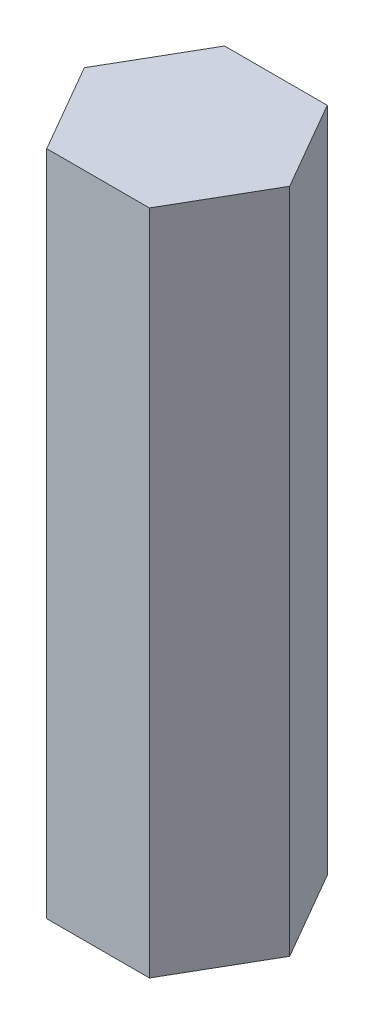
ISO-10303-21;
HEADER;
FILE_DESCRIPTION(('STEP AP214'),'2;1');
FILE_NAME('part.step','',(''),(''),'','','');
FILE_SCHEMA(('AUTOMOTIVE_DESIGN { 1 0 10303 214 1 1 1 1 }'));
ENDSEC;
DATA;
#1=APPLICATION_CONTEXT('core data for automotive mechanical design processes');
#2=APPLICATION_PROTOCOL_DEFINITION('international standard','automotive_design',2000,#1);
#3=PRODUCT_CONTEXT('',#1,'mechanical');
#4=PRODUCT('Part','Part','',(#3));
#5=PRODUCT_RELATED_PRODUCT_CATEGORY('part','',(#4));
#6=PRODUCT_DEFINITION_FORMATION('','',#4);
#7=PRODUCT_DEFINITION_CONTEXT('part definition',#1,'design');
#8=PRODUCT_DEFINITION('design','',#6,#7);
#9=PRODUCT_DEFINITION_SHAPE('','',#8);
#10=(LENGTH_UNIT() NAMED_UNIT(*) SI_UNIT(.MILLI.,.METRE.));
#11=(NAMED_UNIT(*) PLANE_ANGLE_UNIT() SI_UNIT($,.RADIAN.));
#12=(NAMED_UNIT(*) SI_UNIT($,.STERADIAN.) SOLID_ANGLE_UNIT());
#13=UNCERTAINTY_MEASURE_WITH_UNIT(LENGTH_MEASURE(1.E-05),#10,'distance_accuracy_value','');
#14=(GEOMETRIC_REPRESENTATION_CONTEXT(3) GLOBAL_UNCERTAINTY_ASSIGNED_CONTEXT((#13)) GLOBAL_UNIT_ASSIGNED_CONTEXT((#10,
#11,#12)) REPRESENTATION_CONTEXT('',''));
#15=CARTESIAN_POINT('',(0.,0.,0.));
#16=DIRECTION('',(0.,0.,1.));
#17=DIRECTION('',(1.,0.,0.));
#18=AXIS2_PLACEMENT_3D('',#15,#16,#17);
#19=CARTESIAN_POINT('',(1.15470053837927,15.,1.99999999999998));
#20=DIRECTION('',(-0.866025403784442,0.,-0.499999999999995));
#21=DIRECTION('',(-0.499999999999995,0.,0.866025403784442));
#22=AXIS2_PLACEMENT_3D('',#19,#20,#21);
#23=PLANE('',#22);
#24=DIRECTION('',(0.499999999999995,0.,-0.866025403784442));
#25=VECTOR('',#24,1.);
#26=CARTESIAN_POINT('',(1.15470053837927,0.,1.99999999999998));
#27=LINE('',#26,#25);
#28=CARTESIAN_POINT('',(1.15470053837927,0.,1.99999999999998));
#29=VERTEX_POINT('',#28);
#30=CARTESIAN_POINT('',(2.3094010767585,0.,0.));
#31=VERTEX_POINT('',#30);
#32=EDGE_CURVE('E128',#29,#31,#27,.T.);
#33=ORIENTED_EDGE('',*,*,#32,.T.);
#34=DIRECTION('',(0.,-1.,0.));
#35=VECTOR('',#34,1.);
#36=CARTESIAN_POINT('',(2.3094010767585,15.,0.));
#37=LINE('',#36,#35);
#38=CARTESIAN_POINT('',(2.3094010767585,15.,0.));
#39=VERTEX_POINT('',#38);
#40=EDGE_CURVE('E11',#39,#31,#37,.T.);
#41=ORIENTED_EDGE('',*,*,#40,.F.);
#42=DIRECTION('',(0.499999999999995,0.,-0.866025403784442));
#43=VECTOR('',#42,1.);
#44=CARTESIAN_POINT('',(1.15470053837927,15.,1.99999999999998));
#45=LINE('',#44,#43);
#46=CARTESIAN_POINT('',(1.15470053837927,15.,1.99999999999998));
#47=VERTEX_POINT('',#46);
#48=EDGE_CURVE('E144',#47,#39,#45,.T.);
#49=ORIENTED_EDGE('',*,*,#48,.F.);
#50=DIRECTION('',(0.,-1.,0.));
#51=VECTOR('',#50,1.);
#52=CARTESIAN_POINT('',(1.15470053837927,15.,1.99999999999998));
#53=LINE('',#52,#51);
#54=EDGE_CURVE('E124',#47,#29,#53,.T.);
#55=ORIENTED_EDGE('',*,*,#54,.T.);
#56=EDGE_LOOP('',(#33,#41,#49,#55));
#57=FACE_BOUND('',#56,.T.);
#58=ADVANCED_FACE('F39',(#57),#23,.F.);
#59=CARTESIAN_POINT('',(2.3094010767585,15.,0.));
#60=DIRECTION('',(-0.866025403784438,0.,0.500000000000001));
#61=DIRECTION('',(0.500000000000001,0.,0.866025403784438));
#62=AXIS2_PLACEMENT_3D('',#59,#60,#61);
#63=PLANE('',#62);
#64=DIRECTION('',(-0.500000000000001,0.,-0.866025403784438));
#65=VECTOR('',#64,1.);
#66=CARTESIAN_POINT('',(2.3094010767585,0.,0.));
#67=LINE('',#66,#65);
#68=CARTESIAN_POINT('',(1.15470053837925,0.,-2.));
#69=VERTEX_POINT('',#68);
#70=EDGE_CURVE('E132',#31,#69,#67,.T.);
#71=ORIENTED_EDGE('',*,*,#70,.T.);
#72=DIRECTION('',(0.,-1.,0.));
#73=VECTOR('',#72,1.);
#74=CARTESIAN_POINT('',(1.15470053837925,15.,-2.));
#75=LINE('',#74,#73);
#76=CARTESIAN_POINT('',(1.15470053837925,15.,-2.));
#77=VERTEX_POINT('',#76);
#78=EDGE_CURVE('E48',#77,#69,#75,.T.);
#79=ORIENTED_EDGE('',*,*,#78,.F.);
#80=DIRECTION('',(-0.500000000000001,0.,-0.866025403784438));
#81=VECTOR('',#80,1.);
#82=CARTESIAN_POINT('',(2.3094010767585,15.,0.));
#83=LINE('',#82,#81);
#84=EDGE_CURVE('E93',#39,#77,#83,.T.);
#85=ORIENTED_EDGE('',*,*,#84,.F.);
#86=ORIENTED_EDGE('',*,*,#40,.T.);
#87=EDGE_LOOP('',(#71,#79,#85,#86));
#88=FACE_BOUND('',#87,.T.);
#89=ADVANCED_FACE('F172',(#88),#63,.F.);
#90=CARTESIAN_POINT('',(1.15470053837925,15.,-2.));
#91=DIRECTION('',(0.,0.,1.));
#92=DIRECTION('',(1.,0.,0.));
#93=AXIS2_PLACEMENT_3D('',#90,#91,#92);
#94=PLANE('',#93);
#95=DIRECTION('',(-1.,0.,0.));
#96=VECTOR('',#95,1.);
#97=CARTESIAN_POINT('',(1.15470053837925,0.,-2.));
#98=LINE('',#97,#96);
#99=CARTESIAN_POINT('',(-1.15470053837926,0.,-1.99999999999999));
#100=VERTEX_POINT('',#99);
#101=EDGE_CURVE('E135',#69,#100,#98,.T.);
#102=ORIENTED_EDGE('',*,*,#101,.T.);
#103=DIRECTION('',(0.,-1.,0.));
#104=VECTOR('',#103,1.);
#105=CARTESIAN_POINT('',(-1.15470053837926,15.,-1.99999999999999));
#106=LINE('',#105,#104);
#107=CARTESIAN_POINT('',(-1.15470053837926,15.,-1.99999999999999));
#108=VERTEX_POINT('',#107);
#109=EDGE_CURVE('E117',#108,#100,#106,.T.);
#110=ORIENTED_EDGE('',*,*,#109,.F.);
#111=DIRECTION('',(-1.,0.,0.));
#112=VECTOR('',#111,1.);
#113=CARTESIAN_POINT('',(1.15470053837925,15.,-2.));
#114=LINE('',#113,#112);
#115=EDGE_CURVE('E106',#77,#108,#114,.T.);
#116=ORIENTED_EDGE('',*,*,#115,.F.);
#117=ORIENTED_EDGE('',*,*,#78,.T.);
#118=EDGE_LOOP('',(#102,#110,#116,#117));
#119=FACE_BOUND('',#118,.T.);
#120=ADVANCED_FACE('F154',(#119),#94,.F.);
#121=CARTESIAN_POINT('',(-1.15470053837926,15.,-1.99999999999999));
#122=DIRECTION('',(0.866025403784441,0.,0.499999999999995));
#123=DIRECTION('',(0.499999999999995,0.,-0.866025403784442));
#124=AXIS2_PLACEMENT_3D('',#121,#122,#123);
#125=PLANE('',#124);
#126=DIRECTION('',(-0.499999999999995,0.,0.866025403784442));
#127=VECTOR('',#126,1.);
#128=CARTESIAN_POINT('',(-1.15470053837926,0.,-1.99999999999999));
#129=LINE('',#128,#127);
#130=CARTESIAN_POINT('',(-2.3094010767585,0.,0.));
#131=VERTEX_POINT('',#130);
#132=EDGE_CURVE('E115',#100,#131,#129,.T.);
#133=ORIENTED_EDGE('',*,*,#132,.T.);
#134=DIRECTION('',(0.,-1.,0.));
#135=VECTOR('',#134,1.);
#136=CARTESIAN_POINT('',(-2.3094010767585,15.,0.));
#137=LINE('',#136,#135);
#138=CARTESIAN_POINT('',(-2.3094010767585,15.,0.));
#139=VERTEX_POINT('',#138);
#140=EDGE_CURVE('E112',#139,#131,#137,.T.);
#141=ORIENTED_EDGE('',*,*,#140,.F.);
#142=DIRECTION('',(-0.499999999999995,0.,0.866025403784442));
#143=VECTOR('',#142,1.);
#144=CARTESIAN_POINT('',(-1.15470053837926,15.,-1.99999999999999));
#145=LINE('',#144,#143);
#146=EDGE_CURVE('E100',#108,#139,#145,.T.);
#147=ORIENTED_EDGE('',*,*,#146,.F.);
#148=ORIENTED_EDGE('',*,*,#109,.T.);
#149=EDGE_LOOP('',(#133,#141,#147,#148));
#150=FACE_BOUND('',#149,.T.);
#151=ADVANCED_FACE('F113',(#150),#125,.F.);
#152=CARTESIAN_POINT('',(-2.3094010767585,15.,0.));
#153=DIRECTION('',(0.866025403784435,0.,-0.500000000000007));
#154=DIRECTION('',(-0.500000000000007,0.,-0.866025403784435));
#155=AXIS2_PLACEMENT_3D('',#152,#153,#154);
#156=PLANE('',#155);
#157=DIRECTION('',(0.500000000000007,0.,0.866025403784435));
#158=VECTOR('',#157,1.);
#159=CARTESIAN_POINT('',(-2.3094010767585,0.,0.));
#160=LINE('',#159,#158);
#161=CARTESIAN_POINT('',(-1.15470053837923,0.,2.00000000000001));
#162=VERTEX_POINT('',#161);
#163=EDGE_CURVE('E79',#131,#162,#160,.T.);
#164=ORIENTED_EDGE('',*,*,#163,.T.);
#165=DIRECTION('',(0.,-1.,0.));
#166=VECTOR('',#165,1.);
#167=CARTESIAN_POINT('',(-1.15470053837923,15.,2.00000000000001));
#168=LINE('',#167,#166);
#169=CARTESIAN_POINT('',(-1.15470053837923,15.,2.00000000000001));
#170=VERTEX_POINT('',#169);
#171=EDGE_CURVE('E118',#170,#162,#168,.T.);
#172=ORIENTED_EDGE('',*,*,#171,.F.);
#173=DIRECTION('',(0.500000000000007,0.,0.866025403784435));
#174=VECTOR('',#173,1.);
#175=CARTESIAN_POINT('',(-2.3094010767585,15.,0.));
#176=LINE('',#175,#174);
#177=EDGE_CURVE('E104',#139,#170,#176,.T.);
#178=ORIENTED_EDGE('',*,*,#177,.F.);
#179=ORIENTED_EDGE('',*,*,#140,.T.);
#180=EDGE_LOOP('',(#164,#172,#178,#179));
#181=FACE_BOUND('',#180,.T.);
#182=ADVANCED_FACE('F120',(#181),#156,.F.);
#183=CARTESIAN_POINT('',(-1.15470053837923,15.,2.00000000000001));
#184=DIRECTION('',(0.,0.,-1.));
#185=DIRECTION('',(-1.,0.,0.));
#186=AXIS2_PLACEMENT_3D('',#183,#184,#185);
#187=PLANE('',#186);
#188=DIRECTION('',(1.,0.,0.));
#189=VECTOR('',#188,1.);
#190=CARTESIAN_POINT('',(-1.15470053837923,0.,2.00000000000001));
#191=LINE('',#190,#189);
#192=EDGE_CURVE('E85',#162,#29,#191,.T.);
#193=ORIENTED_EDGE('',*,*,#192,.T.);
#194=ORIENTED_EDGE('',*,*,#54,.F.);
#195=DIRECTION('',(1.,0.,0.));
#196=VECTOR('',#195,1.);
#197=CARTESIAN_POINT('',(-1.15470053837923,15.,2.00000000000001));
#198=LINE('',#197,#196);
#199=EDGE_CURVE('E56',#170,#47,#198,.T.);
#200=ORIENTED_EDGE('',*,*,#199,.F.);
#201=ORIENTED_EDGE('',*,*,#171,.T.);
#202=EDGE_LOOP('',(#193,#194,#200,#201));
#203=FACE_BOUND('',#202,.T.);
#204=ADVANCED_FACE('F161',(#203),#187,.F.);
#205=CARTESIAN_POINT('',(0.,15.,0.));
#206=DIRECTION('',(0.,1.,0.));
#207=DIRECTION('',(0.,0.,1.));
#208=AXIS2_PLACEMENT_3D('',#205,#206,#207);
#209=PLANE('',#208);
#210=ORIENTED_EDGE('',*,*,#48,.T.);
#211=ORIENTED_EDGE('',*,*,#84,.T.);
#212=ORIENTED_EDGE('',*,*,#115,.T.);
#213=ORIENTED_EDGE('',*,*,#146,.T.);
#214=ORIENTED_EDGE('',*,*,#177,.T.);
#215=ORIENTED_EDGE('',*,*,#199,.T.);
#216=EDGE_LOOP('',(#210,#211,#212,#213,#214,#215));
#217=FACE_BOUND('',#216,.T.);
#218=ADVANCED_FACE('F102',(#217),#209,.T.);
#219=CARTESIAN_POINT('',(0.,0.,0.));
#220=DIRECTION('',(0.,1.,0.));
#221=DIRECTION('',(0.,0.,1.));
#222=AXIS2_PLACEMENT_3D('',#219,#220,#221);
#223=PLANE('',#222);
#224=ORIENTED_EDGE('',*,*,#32,.F.);
#225=ORIENTED_EDGE('',*,*,#192,.F.);
#226=ORIENTED_EDGE('',*,*,#163,.F.);
#227=ORIENTED_EDGE('',*,*,#132,.F.);
#228=ORIENTED_EDGE('',*,*,#101,.F.);
#229=ORIENTED_EDGE('',*,*,#70,.F.);
#230=EDGE_LOOP('',(#224,#225,#226,#227,#228,#229));
#231=FACE_BOUND('',#230,.T.);
#232=ADVANCED_FACE('F157',(#231),#223,.F.);
#233=CLOSED_SHELL('',(#58,#89,#120,#151,#182,#204,#218,#232));
#234=MANIFOLD_SOLID_BREP('B2',#233);
#235=ADVANCED_BREP_SHAPE_REPRESENTATION('',(#18,#234),#14);
#236=SHAPE_DEFINITION_REPRESENTATION(#9,#235);
ENDSEC;
END-ISO-10303-21;
